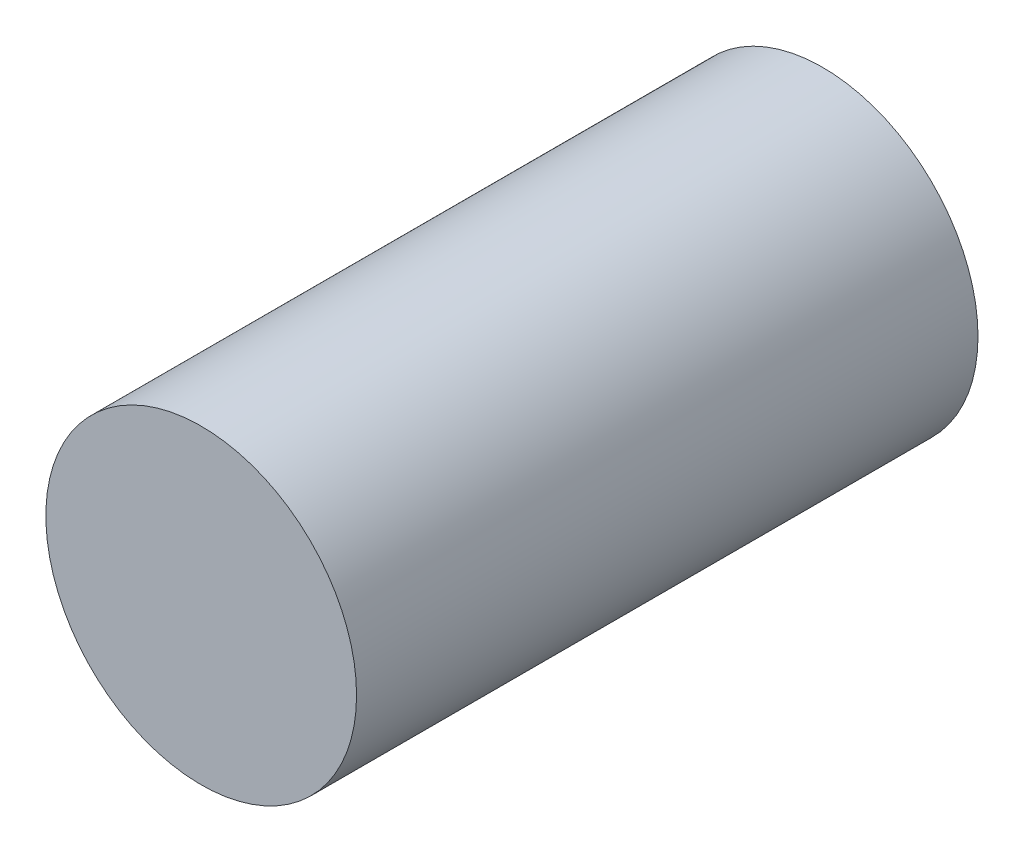
ISO-10303-21;
HEADER;
FILE_DESCRIPTION(('STEP AP214'),'2;1');
FILE_NAME('part.step','',(''),(''),'','','');
FILE_SCHEMA(('AUTOMOTIVE_DESIGN { 1 0 10303 214 1 1 1 1 }'));
ENDSEC;
DATA;
#1=APPLICATION_CONTEXT('core data for automotive mechanical design processes');
#2=APPLICATION_PROTOCOL_DEFINITION('international standard','automotive_design',2000,#1);
#3=PRODUCT_CONTEXT('',#1,'mechanical');
#4=PRODUCT('Part','Part','',(#3));
#5=PRODUCT_RELATED_PRODUCT_CATEGORY('part','',(#4));
#6=PRODUCT_DEFINITION_FORMATION('','',#4);
#7=PRODUCT_DEFINITION_CONTEXT('part definition',#1,'design');
#8=PRODUCT_DEFINITION('design','',#6,#7);
#9=PRODUCT_DEFINITION_SHAPE('','',#8);
#10=(LENGTH_UNIT() NAMED_UNIT(*) SI_UNIT(.MILLI.,.METRE.));
#11=(NAMED_UNIT(*) PLANE_ANGLE_UNIT() SI_UNIT($,.RADIAN.));
#12=(NAMED_UNIT(*) SI_UNIT($,.STERADIAN.) SOLID_ANGLE_UNIT());
#13=UNCERTAINTY_MEASURE_WITH_UNIT(LENGTH_MEASURE(1.E-05),#10,'distance_accuracy_value','');
#14=(GEOMETRIC_REPRESENTATION_CONTEXT(3) GLOBAL_UNCERTAINTY_ASSIGNED_CONTEXT((#13)) GLOBAL_UNIT_ASSIGNED_CONTEXT((#10,
#11,#12)) REPRESENTATION_CONTEXT('',''));
#15=CARTESIAN_POINT('',(0.,0.,0.));
#16=DIRECTION('',(0.,0.,1.));
#17=DIRECTION('',(1.,0.,0.));
#18=AXIS2_PLACEMENT_3D('',#15,#16,#17);
#19=CARTESIAN_POINT('',(0.,0.,100.));
#20=DIRECTION('',(0.,0.,-1.));
#21=DIRECTION('',(-1.,0.,0.));
#22=AXIS2_PLACEMENT_3D('',#19,#20,#21);
#23=CYLINDRICAL_SURFACE('',#22,25.);
#24=CARTESIAN_POINT('',(0.,0.,100.));
#25=DIRECTION('',(0.,0.,1.));
#26=DIRECTION('',(1.,0.,0.));
#27=AXIS2_PLACEMENT_3D('',#24,#25,#26);
#28=CIRCLE('',#27,25.);
#29=CARTESIAN_POINT('',(25.,0.,100.));
#30=VERTEX_POINT('',#29);
#31=EDGE_CURVE('E10',#30,#30,#28,.T.);
#32=ORIENTED_EDGE('',*,*,#31,.F.);
#33=EDGE_LOOP('',(#32));
#34=FACE_BOUND('',#33,.T.);
#35=CARTESIAN_POINT('',(0.,0.,0.));
#36=DIRECTION('',(0.,0.,1.));
#37=DIRECTION('',(1.,0.,0.));
#38=AXIS2_PLACEMENT_3D('',#35,#36,#37);
#39=CIRCLE('',#38,25.);
#40=CARTESIAN_POINT('',(25.,0.,0.));
#41=VERTEX_POINT('',#40);
#42=EDGE_CURVE('E38',#41,#41,#39,.T.);
#43=ORIENTED_EDGE('',*,*,#42,.T.);
#44=EDGE_LOOP('',(#43));
#45=FACE_BOUND('',#44,.T.);
#46=ADVANCED_FACE('F35',(#34,#45),#23,.T.);
#47=CARTESIAN_POINT('',(0.,0.,100.));
#48=DIRECTION('',(0.,0.,1.));
#49=DIRECTION('',(1.,0.,0.));
#50=AXIS2_PLACEMENT_3D('',#47,#48,#49);
#51=PLANE('',#50);
#52=ORIENTED_EDGE('',*,*,#31,.T.);
#53=EDGE_LOOP('',(#52));
#54=FACE_BOUND('',#53,.T.);
#55=ADVANCED_FACE('F50',(#54),#51,.T.);
#56=CARTESIAN_POINT('',(0.,0.,0.));
#57=DIRECTION('',(0.,0.,1.));
#58=DIRECTION('',(1.,0.,0.));
#59=AXIS2_PLACEMENT_3D('',#56,#57,#58);
#60=PLANE('',#59);
#61=ORIENTED_EDGE('',*,*,#42,.F.);
#62=EDGE_LOOP('',(#61));
#63=FACE_BOUND('',#62,.T.);
#64=ADVANCED_FACE('F48',(#63),#60,.F.);
#65=CLOSED_SHELL('',(#46,#55,#64));
#66=MANIFOLD_SOLID_BREP('B2',#65);
#67=ADVANCED_BREP_SHAPE_REPRESENTATION('',(#18,#66),#14);
#68=SHAPE_DEFINITION_REPRESENTATION(#9,#67);
ENDSEC;
END-ISO-10303-21;
